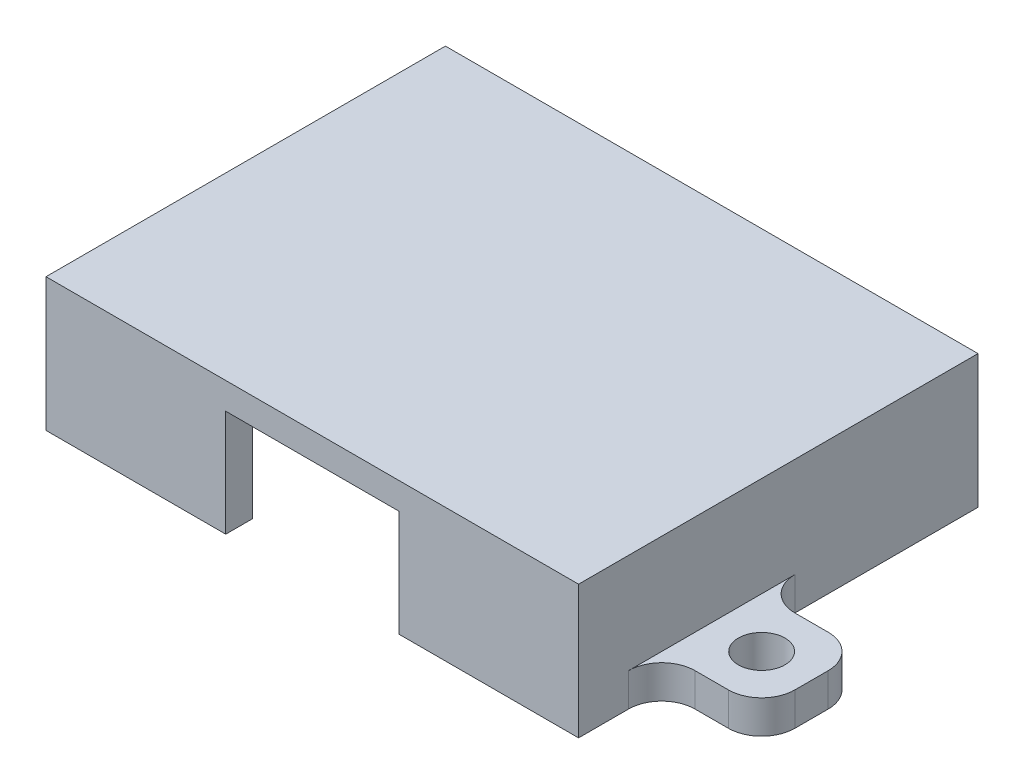
ISO-10303-21;
HEADER;
FILE_DESCRIPTION(('STEP AP214'),'2;1');
FILE_NAME('part.step','',(''),(''),'','','');
FILE_SCHEMA(('AUTOMOTIVE_DESIGN { 1 0 10303 214 1 1 1 1 }'));
ENDSEC;
DATA;
#1=APPLICATION_CONTEXT('core data for automotive mechanical design processes');
#2=APPLICATION_PROTOCOL_DEFINITION('international standard','automotive_design',2000,#1);
#3=PRODUCT_CONTEXT('',#1,'mechanical');
#4=PRODUCT('Part','Part','',(#3));
#5=PRODUCT_RELATED_PRODUCT_CATEGORY('part','',(#4));
#6=PRODUCT_DEFINITION_FORMATION('','',#4);
#7=PRODUCT_DEFINITION_CONTEXT('part definition',#1,'design');
#8=PRODUCT_DEFINITION('design','',#6,#7);
#9=PRODUCT_DEFINITION_SHAPE('','',#8);
#10=(LENGTH_UNIT() NAMED_UNIT(*) SI_UNIT(.MILLI.,.METRE.));
#11=(NAMED_UNIT(*) PLANE_ANGLE_UNIT() SI_UNIT($,.RADIAN.));
#12=(NAMED_UNIT(*) SI_UNIT($,.STERADIAN.) SOLID_ANGLE_UNIT());
#13=UNCERTAINTY_MEASURE_WITH_UNIT(LENGTH_MEASURE(1.E-05),#10,'distance_accuracy_value','');
#14=(GEOMETRIC_REPRESENTATION_CONTEXT(3) GLOBAL_UNCERTAINTY_ASSIGNED_CONTEXT((#13)) GLOBAL_UNIT_ASSIGNED_CONTEXT((#10,
#11,#12)) REPRESENTATION_CONTEXT('',''));
#15=CARTESIAN_POINT('',(0.,0.,0.));
#16=DIRECTION('',(0.,0.,1.));
#17=DIRECTION('',(1.,0.,0.));
#18=AXIS2_PLACEMENT_3D('',#15,#16,#17);
#19=CARTESIAN_POINT('',(0.,10.,0.));
#20=DIRECTION('',(1.,0.,0.));
#21=DIRECTION('',(0.,0.,-1.));
#22=AXIS2_PLACEMENT_3D('',#19,#20,#21);
#23=PLANE('',#22);
#24=DIRECTION('',(0.,0.,-1.));
#25=VECTOR('',#24,1.);
#26=CARTESIAN_POINT('',(0.,2.5,-6.25));
#27=LINE('',#26,#25);
#28=CARTESIAN_POINT('',(0.,2.5,-3.75));
#29=VERTEX_POINT('',#28);
#30=CARTESIAN_POINT('',(0.,2.5,-16.25));
#31=VERTEX_POINT('',#30);
#32=EDGE_CURVE('E492',#29,#31,#27,.T.);
#33=ORIENTED_EDGE('',*,*,#32,.F.);
#34=DIRECTION('',(0.,1.,0.));
#35=VECTOR('',#34,1.);
#36=CARTESIAN_POINT('',(0.,0.,-3.75));
#37=LINE('',#36,#35);
#38=CARTESIAN_POINT('',(0.,0.,-3.75));
#39=VERTEX_POINT('',#38);
#40=EDGE_CURVE('E356',#29,#39,#37,.F.);
#41=ORIENTED_EDGE('',*,*,#40,.T.);
#42=DIRECTION('',(0.,0.,1.));
#43=VECTOR('',#42,1.);
#44=CARTESIAN_POINT('',(0.,0.,0.));
#45=LINE('',#44,#43);
#46=CARTESIAN_POINT('',(0.,0.,0.));
#47=VERTEX_POINT('',#46);
#48=EDGE_CURVE('E310',#39,#47,#45,.T.);
#49=ORIENTED_EDGE('',*,*,#48,.T.);
#50=DIRECTION('',(0.,-1.,0.));
#51=VECTOR('',#50,1.);
#52=CARTESIAN_POINT('',(0.,10.,0.));
#53=LINE('',#52,#51);
#54=CARTESIAN_POINT('',(0.,10.,0.));
#55=VERTEX_POINT('',#54);
#56=EDGE_CURVE('E345',#55,#47,#53,.T.);
#57=ORIENTED_EDGE('',*,*,#56,.F.);
#58=DIRECTION('',(0.,0.,1.));
#59=VECTOR('',#58,1.);
#60=CARTESIAN_POINT('',(0.,10.,0.));
#61=LINE('',#60,#59);
#62=CARTESIAN_POINT('',(0.,10.,-30.));
#63=VERTEX_POINT('',#62);
#64=EDGE_CURVE('E312',#63,#55,#61,.T.);
#65=ORIENTED_EDGE('',*,*,#64,.F.);
#66=DIRECTION('',(0.,-1.,0.));
#67=VECTOR('',#66,1.);
#68=CARTESIAN_POINT('',(0.,10.,-30.));
#69=LINE('',#68,#67);
#70=CARTESIAN_POINT('',(0.,0.,-30.));
#71=VERTEX_POINT('',#70);
#72=EDGE_CURVE('E322',#63,#71,#69,.T.);
#73=ORIENTED_EDGE('',*,*,#72,.T.);
#74=CARTESIAN_POINT('',(0.,0.,-16.25));
#75=VERTEX_POINT('',#74);
#76=EDGE_CURVE('E323',#71,#75,#45,.T.);
#77=ORIENTED_EDGE('',*,*,#76,.T.);
#78=DIRECTION('',(0.,-1.,0.));
#79=VECTOR('',#78,1.);
#80=CARTESIAN_POINT('',(0.,2.5,-16.25));
#81=LINE('',#80,#79);
#82=EDGE_CURVE('E353',#75,#31,#81,.F.);
#83=ORIENTED_EDGE('',*,*,#82,.T.);
#84=EDGE_LOOP('',(#33,#41,#49,#57,#65,#73,#77,#83));
#85=FACE_BOUND('',#84,.T.);
#86=ADVANCED_FACE('F34',(#85),#23,.F.);
#87=CARTESIAN_POINT('',(0.,0.,0.));
#88=DIRECTION('',(0.,-1.,0.));
#89=DIRECTION('',(0.,0.,-1.));
#90=AXIS2_PLACEMENT_3D('',#87,#88,#89);
#91=PLANE('',#90);
#92=CARTESIAN_POINT('',(43.75,0.,-10.));
#93=DIRECTION('',(0.,-1.,0.));
#94=DIRECTION('',(0.,0.,1.));
#95=AXIS2_PLACEMENT_3D('',#92,#93,#94);
#96=CIRCLE('',#95,1.75);
#97=CARTESIAN_POINT('',(43.75,0.,-8.25));
#98=VERTEX_POINT('',#97);
#99=EDGE_CURVE('E645',#98,#98,#96,.T.);
#100=ORIENTED_EDGE('',*,*,#99,.F.);
#101=EDGE_LOOP('',(#100));
#102=FACE_BOUND('',#101,.T.);
#103=DIRECTION('',(-1.,0.,0.));
#104=VECTOR('',#103,1.);
#105=CARTESIAN_POINT('',(47.5,0.,-13.75));
#106=LINE('',#105,#104);
#107=CARTESIAN_POINT('',(45.,0.,-13.75));
#108=VERTEX_POINT('',#107);
#109=CARTESIAN_POINT('',(42.5,0.,-13.75));
#110=VERTEX_POINT('',#109);
#111=EDGE_CURVE('E472',#108,#110,#106,.T.);
#112=ORIENTED_EDGE('',*,*,#111,.F.);
#113=CARTESIAN_POINT('',(45.,0.,-11.25));
#114=DIRECTION('',(0.,-1.,0.));
#115=DIRECTION('',(0.,0.,-1.));
#116=AXIS2_PLACEMENT_3D('',#113,#114,#115);
#117=CIRCLE('',#116,2.5);
#118=CARTESIAN_POINT('',(47.5,0.,-11.25));
#119=VERTEX_POINT('',#118);
#120=EDGE_CURVE('E393',#108,#119,#117,.T.);
#121=ORIENTED_EDGE('',*,*,#120,.T.);
#122=DIRECTION('',(0.,0.,1.));
#123=VECTOR('',#122,1.);
#124=CARTESIAN_POINT('',(47.5,0.,-6.25));
#125=LINE('',#124,#123);
#126=CARTESIAN_POINT('',(47.5,0.,-8.75));
#127=VERTEX_POINT('',#126);
#128=EDGE_CURVE('E640',#119,#127,#125,.T.);
#129=ORIENTED_EDGE('',*,*,#128,.T.);
#130=CARTESIAN_POINT('',(45.,0.,-8.75));
#131=DIRECTION('',(0.,-1.,0.));
#132=DIRECTION('',(0.,0.,-1.));
#133=AXIS2_PLACEMENT_3D('',#130,#131,#132);
#134=CIRCLE('',#133,2.5);
#135=CARTESIAN_POINT('',(45.,0.,-6.25));
#136=VERTEX_POINT('',#135);
#137=EDGE_CURVE('E391',#127,#136,#134,.T.);
#138=ORIENTED_EDGE('',*,*,#137,.T.);
#139=DIRECTION('',(-1.,0.,0.));
#140=VECTOR('',#139,1.);
#141=CARTESIAN_POINT('',(47.5,0.,-6.25));
#142=LINE('',#141,#140);
#143=CARTESIAN_POINT('',(42.5,0.,-6.25));
#144=VERTEX_POINT('',#143);
#145=EDGE_CURVE('E437',#136,#144,#142,.T.);
#146=ORIENTED_EDGE('',*,*,#145,.T.);
#147=CARTESIAN_POINT('',(42.5,0.,-3.75));
#148=DIRECTION('',(0.,-1.,0.));
#149=DIRECTION('',(0.,0.,-1.));
#150=AXIS2_PLACEMENT_3D('',#147,#148,#149);
#151=CIRCLE('',#150,2.5);
#152=CARTESIAN_POINT('',(40.,0.,-3.75));
#153=VERTEX_POINT('',#152);
#154=EDGE_CURVE('E12',#144,#153,#151,.F.);
#155=ORIENTED_EDGE('',*,*,#154,.T.);
#156=DIRECTION('',(0.,0.,-1.));
#157=VECTOR('',#156,1.);
#158=CARTESIAN_POINT('',(40.,0.,0.));
#159=LINE('',#158,#157);
#160=CARTESIAN_POINT('',(40.,0.,0.));
#161=VERTEX_POINT('',#160);
#162=EDGE_CURVE('E331',#161,#153,#159,.T.);
#163=ORIENTED_EDGE('',*,*,#162,.F.);
#164=DIRECTION('',(1.,0.,0.));
#165=VECTOR('',#164,1.);
#166=CARTESIAN_POINT('',(0.,0.,0.));
#167=LINE('',#166,#165);
#168=CARTESIAN_POINT('',(26.5,0.,0.));
#169=VERTEX_POINT('',#168);
#170=EDGE_CURVE('E326',#169,#161,#167,.T.);
#171=ORIENTED_EDGE('',*,*,#170,.F.);
#172=DIRECTION('',(0.,0.,1.));
#173=VECTOR('',#172,1.);
#174=CARTESIAN_POINT('',(26.5,0.,0.));
#175=LINE('',#174,#173);
#176=CARTESIAN_POINT('',(26.5,0.,-2.));
#177=VERTEX_POINT('',#176);
#178=EDGE_CURVE('E284',#177,#169,#175,.T.);
#179=ORIENTED_EDGE('',*,*,#178,.F.);
#180=DIRECTION('',(-1.,0.,0.));
#181=VECTOR('',#180,1.);
#182=CARTESIAN_POINT('',(26.5,0.,-2.));
#183=LINE('',#182,#181);
#184=CARTESIAN_POINT('',(38.,0.,-2.));
#185=VERTEX_POINT('',#184);
#186=EDGE_CURVE('E281',#185,#177,#183,.T.);
#187=ORIENTED_EDGE('',*,*,#186,.F.);
#188=DIRECTION('',(0.,0.,1.));
#189=VECTOR('',#188,1.);
#190=CARTESIAN_POINT('',(38.,0.,-2.));
#191=LINE('',#190,#189);
#192=CARTESIAN_POINT('',(38.,0.,-30.));
#193=VERTEX_POINT('',#192);
#194=EDGE_CURVE('E278',#193,#185,#191,.T.);
#195=ORIENTED_EDGE('',*,*,#194,.F.);
#196=DIRECTION('',(-1.,0.,0.));
#197=VECTOR('',#196,1.);
#198=CARTESIAN_POINT('',(0.,0.,-30.));
#199=LINE('',#198,#197);
#200=CARTESIAN_POINT('',(40.,0.,-30.));
#201=VERTEX_POINT('',#200);
#202=EDGE_CURVE('E316',#201,#193,#199,.T.);
#203=ORIENTED_EDGE('',*,*,#202,.F.);
#204=CARTESIAN_POINT('',(40.,0.,-16.25));
#205=VERTEX_POINT('',#204);
#206=EDGE_CURVE('E330',#205,#201,#159,.T.);
#207=ORIENTED_EDGE('',*,*,#206,.F.);
#208=CARTESIAN_POINT('',(42.5,0.,-16.25));
#209=DIRECTION('',(0.,-1.,0.));
#210=DIRECTION('',(0.,0.,-1.));
#211=AXIS2_PLACEMENT_3D('',#208,#209,#210);
#212=CIRCLE('',#211,2.5);
#213=EDGE_CURVE('E412',#205,#110,#212,.F.);
#214=ORIENTED_EDGE('',*,*,#213,.T.);
#215=EDGE_LOOP('',(#112,#121,#129,#138,#146,#155,#163,#171,#179,#187,#195,#203,#207,#214));
#216=FACE_BOUND('',#215,.T.);
#217=ADVANCED_FACE('F435',(#102,#216),#91,.T.);
#218=DIRECTION('',(0.,0.,-1.));
#219=VECTOR('',#218,1.);
#220=CARTESIAN_POINT('',(32.,0.,-28.));
#221=LINE('',#220,#219);
#222=CARTESIAN_POINT('',(32.,0.,-28.));
#223=VERTEX_POINT('',#222);
#224=CARTESIAN_POINT('',(32.,0.,-30.));
#225=VERTEX_POINT('',#224);
#226=EDGE_CURVE('E276',#223,#225,#221,.T.);
#227=ORIENTED_EDGE('',*,*,#226,.F.);
#228=DIRECTION('',(1.,0.,0.));
#229=VECTOR('',#228,1.);
#230=CARTESIAN_POINT('',(8.,0.,-28.));
#231=LINE('',#230,#229);
#232=CARTESIAN_POINT('',(8.,0.,-28.));
#233=VERTEX_POINT('',#232);
#234=EDGE_CURVE('E270',#233,#223,#231,.T.);
#235=ORIENTED_EDGE('',*,*,#234,.F.);
#236=DIRECTION('',(0.,0.,1.));
#237=VECTOR('',#236,1.);
#238=CARTESIAN_POINT('',(8.,0.,-30.));
#239=LINE('',#238,#237);
#240=CARTESIAN_POINT('',(8.,0.,-30.));
#241=VERTEX_POINT('',#240);
#242=EDGE_CURVE('E267',#241,#233,#239,.T.);
#243=ORIENTED_EDGE('',*,*,#242,.F.);
#244=EDGE_CURVE('E336',#225,#241,#199,.T.);
#245=ORIENTED_EDGE('',*,*,#244,.F.);
#246=EDGE_LOOP('',(#227,#235,#243,#245));
#247=FACE_BOUND('',#246,.T.);
#248=ADVANCED_FACE('F579',(#247),#91,.T.);
#249=CARTESIAN_POINT('',(0.,10.,0.));
#250=DIRECTION('',(0.,0.,-1.));
#251=DIRECTION('',(-1.,0.,0.));
#252=AXIS2_PLACEMENT_3D('',#249,#250,#251);
#253=PLANE('',#252);
#254=CARTESIAN_POINT('',(13.5,0.,0.));
#255=VERTEX_POINT('',#254);
#256=EDGE_CURVE('E327',#47,#255,#167,.T.);
#257=ORIENTED_EDGE('',*,*,#256,.T.);
#258=DIRECTION('',(0.,-1.,0.));
#259=VECTOR('',#258,1.);
#260=CARTESIAN_POINT('',(13.5,56.8614980554399,0.));
#261=LINE('',#260,#259);
#262=CARTESIAN_POINT('',(13.5,8.,0.));
#263=VERTEX_POINT('',#262);
#264=EDGE_CURVE('E286',#263,#255,#261,.T.);
#265=ORIENTED_EDGE('',*,*,#264,.F.);
#266=DIRECTION('',(1.,0.,0.));
#267=VECTOR('',#266,1.);
#268=CARTESIAN_POINT('',(13.5,8.,0.));
#269=LINE('',#268,#267);
#270=CARTESIAN_POINT('',(26.5,8.,0.));
#271=VERTEX_POINT('',#270);
#272=EDGE_CURVE('E530',#263,#271,#269,.T.);
#273=ORIENTED_EDGE('',*,*,#272,.T.);
#274=DIRECTION('',(0.,-1.,0.));
#275=VECTOR('',#274,1.);
#276=CARTESIAN_POINT('',(26.5,56.8614980554399,0.));
#277=LINE('',#276,#275);
#278=EDGE_CURVE('E288',#271,#169,#277,.T.);
#279=ORIENTED_EDGE('',*,*,#278,.T.);
#280=ORIENTED_EDGE('',*,*,#170,.T.);
#281=DIRECTION('',(0.,-1.,0.));
#282=VECTOR('',#281,1.);
#283=CARTESIAN_POINT('',(40.,10.,0.));
#284=LINE('',#283,#282);
#285=CARTESIAN_POINT('',(40.,10.,0.));
#286=VERTEX_POINT('',#285);
#287=EDGE_CURVE('E342',#286,#161,#284,.T.);
#288=ORIENTED_EDGE('',*,*,#287,.F.);
#289=DIRECTION('',(1.,0.,0.));
#290=VECTOR('',#289,1.);
#291=CARTESIAN_POINT('',(0.,10.,0.));
#292=LINE('',#291,#290);
#293=EDGE_CURVE('E315',#55,#286,#292,.T.);
#294=ORIENTED_EDGE('',*,*,#293,.F.);
#295=ORIENTED_EDGE('',*,*,#56,.T.);
#296=EDGE_LOOP('',(#257,#265,#273,#279,#280,#288,#294,#295));
#297=FACE_BOUND('',#296,.T.);
#298=ADVANCED_FACE('F443',(#297),#253,.F.);
#299=CARTESIAN_POINT('',(40.,10.,0.));
#300=DIRECTION('',(-1.,0.,0.));
#301=DIRECTION('',(0.,0.,1.));
#302=AXIS2_PLACEMENT_3D('',#299,#300,#301);
#303=PLANE('',#302);
#304=DIRECTION('',(0.,0.,-1.));
#305=VECTOR('',#304,1.);
#306=CARTESIAN_POINT('',(40.,2.5,-6.25));
#307=LINE('',#306,#305);
#308=CARTESIAN_POINT('',(40.,2.5,-3.75));
#309=VERTEX_POINT('',#308);
#310=CARTESIAN_POINT('',(40.,2.5,-16.25));
#311=VERTEX_POINT('',#310);
#312=EDGE_CURVE('E49',#309,#311,#307,.T.);
#313=ORIENTED_EDGE('',*,*,#312,.T.);
#314=DIRECTION('',(0.,-1.,0.));
#315=VECTOR('',#314,1.);
#316=CARTESIAN_POINT('',(40.,10.,-16.25));
#317=LINE('',#316,#315);
#318=EDGE_CURVE('E405',#311,#205,#317,.T.);
#319=ORIENTED_EDGE('',*,*,#318,.T.);
#320=ORIENTED_EDGE('',*,*,#206,.T.);
#321=DIRECTION('',(0.,-1.,0.));
#322=VECTOR('',#321,1.);
#323=CARTESIAN_POINT('',(40.,10.,-30.));
#324=LINE('',#323,#322);
#325=CARTESIAN_POINT('',(40.,10.,-30.));
#326=VERTEX_POINT('',#325);
#327=EDGE_CURVE('E339',#326,#201,#324,.T.);
#328=ORIENTED_EDGE('',*,*,#327,.F.);
#329=DIRECTION('',(0.,0.,-1.));
#330=VECTOR('',#329,1.);
#331=CARTESIAN_POINT('',(40.,10.,0.));
#332=LINE('',#331,#330);
#333=EDGE_CURVE('E318',#286,#326,#332,.T.);
#334=ORIENTED_EDGE('',*,*,#333,.F.);
#335=ORIENTED_EDGE('',*,*,#287,.T.);
#336=ORIENTED_EDGE('',*,*,#162,.T.);
#337=DIRECTION('',(0.,1.,0.));
#338=VECTOR('',#337,1.);
#339=CARTESIAN_POINT('',(40.,10.,-3.75));
#340=LINE('',#339,#338);
#341=EDGE_CURVE('E403',#153,#309,#340,.T.);
#342=ORIENTED_EDGE('',*,*,#341,.T.);
#343=EDGE_LOOP('',(#313,#319,#320,#328,#334,#335,#336,#342));
#344=FACE_BOUND('',#343,.T.);
#345=ADVANCED_FACE('F438',(#344),#303,.F.);
#346=CARTESIAN_POINT('',(0.,10.,-30.));
#347=DIRECTION('',(0.,0.,1.));
#348=DIRECTION('',(1.,0.,0.));
#349=AXIS2_PLACEMENT_3D('',#346,#347,#348);
#350=PLANE('',#349);
#351=ORIENTED_EDGE('',*,*,#244,.T.);
#352=DIRECTION('',(0.,-1.,0.));
#353=VECTOR('',#352,1.);
#354=CARTESIAN_POINT('',(8.,56.8614980554399,-30.));
#355=LINE('',#354,#353);
#356=CARTESIAN_POINT('',(8.,8.,-30.));
#357=VERTEX_POINT('',#356);
#358=EDGE_CURVE('E304',#357,#241,#355,.T.);
#359=ORIENTED_EDGE('',*,*,#358,.F.);
#360=DIRECTION('',(-1.,0.,0.));
#361=VECTOR('',#360,1.);
#362=CARTESIAN_POINT('',(2.,8.,-30.));
#363=LINE('',#362,#361);
#364=CARTESIAN_POINT('',(2.,8.,-30.));
#365=VERTEX_POINT('',#364);
#366=EDGE_CURVE('E515',#357,#365,#363,.T.);
#367=ORIENTED_EDGE('',*,*,#366,.T.);
#368=DIRECTION('',(0.,-1.,0.));
#369=VECTOR('',#368,1.);
#370=CARTESIAN_POINT('',(2.,56.8614980554399,-30.));
#371=LINE('',#370,#369);
#372=CARTESIAN_POINT('',(2.,0.,-30.));
#373=VERTEX_POINT('',#372);
#374=EDGE_CURVE('E250',#365,#373,#371,.T.);
#375=ORIENTED_EDGE('',*,*,#374,.T.);
#376=EDGE_CURVE('E266',#373,#71,#199,.T.);
#377=ORIENTED_EDGE('',*,*,#376,.T.);
#378=ORIENTED_EDGE('',*,*,#72,.F.);
#379=DIRECTION('',(-1.,0.,0.));
#380=VECTOR('',#379,1.);
#381=CARTESIAN_POINT('',(0.,10.,-30.));
#382=LINE('',#381,#380);
#383=EDGE_CURVE('E320',#326,#63,#382,.T.);
#384=ORIENTED_EDGE('',*,*,#383,.F.);
#385=ORIENTED_EDGE('',*,*,#327,.T.);
#386=ORIENTED_EDGE('',*,*,#202,.T.);
#387=DIRECTION('',(0.,-1.,0.));
#388=VECTOR('',#387,1.);
#389=CARTESIAN_POINT('',(38.,56.8614980554399,-30.));
#390=LINE('',#389,#388);
#391=CARTESIAN_POINT('',(38.,8.,-30.));
#392=VERTEX_POINT('',#391);
#393=EDGE_CURVE('E295',#392,#193,#390,.T.);
#394=ORIENTED_EDGE('',*,*,#393,.F.);
#395=DIRECTION('',(-1.,0.,0.));
#396=VECTOR('',#395,1.);
#397=CARTESIAN_POINT('',(32.,8.,-30.));
#398=LINE('',#397,#396);
#399=CARTESIAN_POINT('',(32.,8.,-30.));
#400=VERTEX_POINT('',#399);
#401=EDGE_CURVE('E524',#392,#400,#398,.T.);
#402=ORIENTED_EDGE('',*,*,#401,.T.);
#403=DIRECTION('',(0.,-1.,0.));
#404=VECTOR('',#403,1.);
#405=CARTESIAN_POINT('',(32.,56.8614980554399,-30.));
#406=LINE('',#405,#404);
#407=EDGE_CURVE('E297',#400,#225,#406,.T.);
#408=ORIENTED_EDGE('',*,*,#407,.T.);
#409=EDGE_LOOP('',(#351,#359,#367,#375,#377,#378,#384,#385,#386,#394,#402,#408));
#410=FACE_BOUND('',#409,.T.);
#411=ADVANCED_FACE('F466',(#410),#350,.F.);
#412=CARTESIAN_POINT('',(0.,10.,0.));
#413=DIRECTION('',(0.,-1.,0.));
#414=DIRECTION('',(0.,0.,-1.));
#415=AXIS2_PLACEMENT_3D('',#412,#413,#414);
#416=PLANE('',#415);
#417=ORIENTED_EDGE('',*,*,#64,.T.);
#418=ORIENTED_EDGE('',*,*,#293,.T.);
#419=ORIENTED_EDGE('',*,*,#333,.T.);
#420=ORIENTED_EDGE('',*,*,#383,.T.);
#421=EDGE_LOOP('',(#417,#418,#419,#420));
#422=FACE_BOUND('',#421,.T.);
#423=ADVANCED_FACE('F751',(#422),#416,.F.);
#424=CARTESIAN_POINT('',(-3.75,0.,-10.));
#425=DIRECTION('',(0.,1.,0.));
#426=DIRECTION('',(0.,0.,1.));
#427=AXIS2_PLACEMENT_3D('',#424,#425,#426);
#428=CIRCLE('',#427,1.75);
#429=CARTESIAN_POINT('',(-3.75,0.,-8.25));
#430=VERTEX_POINT('',#429);
#431=EDGE_CURVE('E489',#430,#430,#428,.T.);
#432=ORIENTED_EDGE('',*,*,#431,.T.);
#433=EDGE_LOOP('',(#432));
#434=FACE_BOUND('',#433,.T.);
#435=DIRECTION('',(1.,0.,0.));
#436=VECTOR('',#435,1.);
#437=CARTESIAN_POINT('',(-7.5,0.,-6.25));
#438=LINE('',#437,#436);
#439=CARTESIAN_POINT('',(-5.,0.,-6.25));
#440=VERTEX_POINT('',#439);
#441=CARTESIAN_POINT('',(-2.5,0.,-6.25));
#442=VERTEX_POINT('',#441);
#443=EDGE_CURVE('E501',#440,#442,#438,.T.);
#444=ORIENTED_EDGE('',*,*,#443,.F.);
#445=CARTESIAN_POINT('',(-5.,0.,-8.75));
#446=DIRECTION('',(0.,-1.,0.));
#447=DIRECTION('',(0.,0.,-1.));
#448=AXIS2_PLACEMENT_3D('',#445,#446,#447);
#449=CIRCLE('',#448,2.5);
#450=CARTESIAN_POINT('',(-7.5,0.,-8.75));
#451=VERTEX_POINT('',#450);
#452=EDGE_CURVE('E370',#440,#451,#449,.T.);
#453=ORIENTED_EDGE('',*,*,#452,.T.);
#454=DIRECTION('',(0.,0.,1.));
#455=VECTOR('',#454,1.);
#456=CARTESIAN_POINT('',(-7.5,0.,-6.25));
#457=LINE('',#456,#455);
#458=CARTESIAN_POINT('',(-7.5,0.,-11.25));
#459=VERTEX_POINT('',#458);
#460=EDGE_CURVE('E498',#459,#451,#457,.T.);
#461=ORIENTED_EDGE('',*,*,#460,.F.);
#462=CARTESIAN_POINT('',(-5.,0.,-11.25));
#463=DIRECTION('',(0.,-1.,0.));
#464=DIRECTION('',(0.,0.,-1.));
#465=AXIS2_PLACEMENT_3D('',#462,#463,#464);
#466=CIRCLE('',#465,2.5);
#467=CARTESIAN_POINT('',(-5.,0.,-13.75));
#468=VERTEX_POINT('',#467);
#469=EDGE_CURVE('E368',#459,#468,#466,.T.);
#470=ORIENTED_EDGE('',*,*,#469,.T.);
#471=DIRECTION('',(1.,0.,0.));
#472=VECTOR('',#471,1.);
#473=CARTESIAN_POINT('',(-7.5,0.,-13.75));
#474=LINE('',#473,#472);
#475=CARTESIAN_POINT('',(-2.5,0.,-13.75));
#476=VERTEX_POINT('',#475);
#477=EDGE_CURVE('E505',#468,#476,#474,.T.);
#478=ORIENTED_EDGE('',*,*,#477,.T.);
#479=CARTESIAN_POINT('',(-2.5,0.,-16.25));
#480=DIRECTION('',(0.,-1.,0.));
#481=DIRECTION('',(0.,0.,-1.));
#482=AXIS2_PLACEMENT_3D('',#479,#480,#481);
#483=CIRCLE('',#482,2.5);
#484=EDGE_CURVE('E382',#476,#75,#483,.F.);
#485=ORIENTED_EDGE('',*,*,#484,.T.);
#486=ORIENTED_EDGE('',*,*,#76,.F.);
#487=ORIENTED_EDGE('',*,*,#376,.F.);
#488=DIRECTION('',(0.,0.,-1.));
#489=VECTOR('',#488,1.);
#490=CARTESIAN_POINT('',(2.,0.,-28.));
#491=LINE('',#490,#489);
#492=CARTESIAN_POINT('',(2.,0.,-2.));
#493=VERTEX_POINT('',#492);
#494=EDGE_CURVE('E245',#493,#373,#491,.T.);
#495=ORIENTED_EDGE('',*,*,#494,.F.);
#496=DIRECTION('',(-1.,0.,0.));
#497=VECTOR('',#496,1.);
#498=CARTESIAN_POINT('',(2.,0.,-2.));
#499=LINE('',#498,#497);
#500=CARTESIAN_POINT('',(13.5,0.,-2.));
#501=VERTEX_POINT('',#500);
#502=EDGE_CURVE('E255',#501,#493,#499,.T.);
#503=ORIENTED_EDGE('',*,*,#502,.F.);
#504=DIRECTION('',(0.,0.,-1.));
#505=VECTOR('',#504,1.);
#506=CARTESIAN_POINT('',(13.5,0.,-2.));
#507=LINE('',#506,#505);
#508=EDGE_CURVE('E260',#255,#501,#507,.T.);
#509=ORIENTED_EDGE('',*,*,#508,.F.);
#510=ORIENTED_EDGE('',*,*,#256,.F.);
#511=ORIENTED_EDGE('',*,*,#48,.F.);
#512=CARTESIAN_POINT('',(-2.5,0.,-3.75));
#513=DIRECTION('',(0.,-1.,0.));
#514=DIRECTION('',(0.,0.,-1.));
#515=AXIS2_PLACEMENT_3D('',#512,#513,#514);
#516=CIRCLE('',#515,2.5);
#517=EDGE_CURVE('E380',#39,#442,#516,.F.);
#518=ORIENTED_EDGE('',*,*,#517,.T.);
#519=EDGE_LOOP('',(#444,#453,#461,#470,#478,#485,#486,#487,#495,#503,#509,#510,#511,#518));
#520=FACE_BOUND('',#519,.T.);
#521=ADVANCED_FACE('F264',(#434,#520),#91,.T.);
#522=CARTESIAN_POINT('',(13.5,56.8614980554399,-2.));
#523=DIRECTION('',(-1.,0.,0.));
#524=DIRECTION('',(0.,0.,1.));
#525=AXIS2_PLACEMENT_3D('',#522,#523,#524);
#526=PLANE('',#525);
#527=DIRECTION('',(0.,0.,1.));
#528=VECTOR('',#527,1.);
#529=CARTESIAN_POINT('',(13.5,8.,-2.));
#530=LINE('',#529,#528);
#531=CARTESIAN_POINT('',(13.5,8.,-2.));
#532=VERTEX_POINT('',#531);
#533=EDGE_CURVE('E311',#532,#263,#530,.T.);
#534=ORIENTED_EDGE('',*,*,#533,.T.);
#535=ORIENTED_EDGE('',*,*,#264,.T.);
#536=ORIENTED_EDGE('',*,*,#508,.T.);
#537=DIRECTION('',(0.,-1.,0.));
#538=VECTOR('',#537,1.);
#539=CARTESIAN_POINT('',(13.5,56.8614980554399,-2.));
#540=LINE('',#539,#538);
#541=EDGE_CURVE('E251',#532,#501,#540,.T.);
#542=ORIENTED_EDGE('',*,*,#541,.F.);
#543=EDGE_LOOP('',(#534,#535,#536,#542));
#544=FACE_BOUND('',#543,.T.);
#545=ADVANCED_FACE('F533',(#544),#526,.F.);
#546=CARTESIAN_POINT('',(26.5,56.8614980554399,0.));
#547=DIRECTION('',(1.,0.,0.));
#548=DIRECTION('',(0.,0.,-1.));
#549=AXIS2_PLACEMENT_3D('',#546,#547,#548);
#550=PLANE('',#549);
#551=DIRECTION('',(0.,0.,-1.));
#552=VECTOR('',#551,1.);
#553=CARTESIAN_POINT('',(26.5,8.,0.));
#554=LINE('',#553,#552);
#555=CARTESIAN_POINT('',(26.5,8.,-2.));
#556=VERTEX_POINT('',#555);
#557=EDGE_CURVE('E452',#271,#556,#554,.T.);
#558=ORIENTED_EDGE('',*,*,#557,.T.);
#559=DIRECTION('',(0.,-1.,0.));
#560=VECTOR('',#559,1.);
#561=CARTESIAN_POINT('',(26.5,56.8614980554399,-2.));
#562=LINE('',#561,#560);
#563=EDGE_CURVE('E291',#556,#177,#562,.T.);
#564=ORIENTED_EDGE('',*,*,#563,.T.);
#565=ORIENTED_EDGE('',*,*,#178,.T.);
#566=ORIENTED_EDGE('',*,*,#278,.F.);
#567=EDGE_LOOP('',(#558,#564,#565,#566));
#568=FACE_BOUND('',#567,.T.);
#569=ADVANCED_FACE('F450',(#568),#550,.F.);
#570=CARTESIAN_POINT('',(26.5,56.8614980554399,-2.));
#571=DIRECTION('',(0.,0.,1.));
#572=DIRECTION('',(1.,0.,0.));
#573=AXIS2_PLACEMENT_3D('',#570,#571,#572);
#574=PLANE('',#573);
#575=DIRECTION('',(1.,0.,0.));
#576=VECTOR('',#575,1.);
#577=CARTESIAN_POINT('',(26.5,8.,-2.));
#578=LINE('',#577,#576);
#579=CARTESIAN_POINT('',(38.,8.,-2.));
#580=VERTEX_POINT('',#579);
#581=EDGE_CURVE('E457',#556,#580,#578,.T.);
#582=ORIENTED_EDGE('',*,*,#581,.T.);
#583=DIRECTION('',(0.,-1.,0.));
#584=VECTOR('',#583,1.);
#585=CARTESIAN_POINT('',(38.,56.8614980554399,-2.));
#586=LINE('',#585,#584);
#587=EDGE_CURVE('E293',#580,#185,#586,.T.);
#588=ORIENTED_EDGE('',*,*,#587,.T.);
#589=ORIENTED_EDGE('',*,*,#186,.T.);
#590=ORIENTED_EDGE('',*,*,#563,.F.);
#591=EDGE_LOOP('',(#582,#588,#589,#590));
#592=FACE_BOUND('',#591,.T.);
#593=ADVANCED_FACE('F455',(#592),#574,.F.);
#594=CARTESIAN_POINT('',(38.,56.8614980554399,-2.));
#595=DIRECTION('',(1.,0.,0.));
#596=DIRECTION('',(0.,0.,-1.));
#597=AXIS2_PLACEMENT_3D('',#594,#595,#596);
#598=PLANE('',#597);
#599=DIRECTION('',(0.,0.,-1.));
#600=VECTOR('',#599,1.);
#601=CARTESIAN_POINT('',(38.,8.,-2.));
#602=LINE('',#601,#600);
#603=EDGE_CURVE('E526',#580,#392,#602,.T.);
#604=ORIENTED_EDGE('',*,*,#603,.T.);
#605=ORIENTED_EDGE('',*,*,#393,.T.);
#606=ORIENTED_EDGE('',*,*,#194,.T.);
#607=ORIENTED_EDGE('',*,*,#587,.F.);
#608=EDGE_LOOP('',(#604,#605,#606,#607));
#609=FACE_BOUND('',#608,.T.);
#610=ADVANCED_FACE('F460',(#609),#598,.F.);
#611=CARTESIAN_POINT('',(32.,56.8614980554399,-28.));
#612=DIRECTION('',(-1.,0.,0.));
#613=DIRECTION('',(0.,0.,1.));
#614=AXIS2_PLACEMENT_3D('',#611,#612,#613);
#615=PLANE('',#614);
#616=DIRECTION('',(0.,0.,1.));
#617=VECTOR('',#616,1.);
#618=CARTESIAN_POINT('',(32.,8.,-28.));
#619=LINE('',#618,#617);
#620=CARTESIAN_POINT('',(32.,8.,-28.));
#621=VERTEX_POINT('',#620);
#622=EDGE_CURVE('E522',#400,#621,#619,.T.);
#623=ORIENTED_EDGE('',*,*,#622,.T.);
#624=DIRECTION('',(0.,-1.,0.));
#625=VECTOR('',#624,1.);
#626=CARTESIAN_POINT('',(32.,56.8614980554399,-28.));
#627=LINE('',#626,#625);
#628=EDGE_CURVE('E300',#621,#223,#627,.T.);
#629=ORIENTED_EDGE('',*,*,#628,.T.);
#630=ORIENTED_EDGE('',*,*,#226,.T.);
#631=ORIENTED_EDGE('',*,*,#407,.F.);
#632=EDGE_LOOP('',(#623,#629,#630,#631));
#633=FACE_BOUND('',#632,.T.);
#634=ADVANCED_FACE('F594',(#633),#615,.F.);
#635=CARTESIAN_POINT('',(8.,56.8614980554399,-28.));
#636=DIRECTION('',(0.,0.,-1.));
#637=DIRECTION('',(-1.,0.,0.));
#638=AXIS2_PLACEMENT_3D('',#635,#636,#637);
#639=PLANE('',#638);
#640=DIRECTION('',(-1.,0.,0.));
#641=VECTOR('',#640,1.);
#642=CARTESIAN_POINT('',(8.,8.,-28.));
#643=LINE('',#642,#641);
#644=CARTESIAN_POINT('',(8.,8.,-28.));
#645=VERTEX_POINT('',#644);
#646=EDGE_CURVE('E520',#621,#645,#643,.T.);
#647=ORIENTED_EDGE('',*,*,#646,.T.);
#648=DIRECTION('',(0.,-1.,0.));
#649=VECTOR('',#648,1.);
#650=CARTESIAN_POINT('',(8.,56.8614980554399,-28.));
#651=LINE('',#650,#649);
#652=EDGE_CURVE('E302',#645,#233,#651,.T.);
#653=ORIENTED_EDGE('',*,*,#652,.T.);
#654=ORIENTED_EDGE('',*,*,#234,.T.);
#655=ORIENTED_EDGE('',*,*,#628,.F.);
#656=EDGE_LOOP('',(#647,#653,#654,#655));
#657=FACE_BOUND('',#656,.T.);
#658=ADVANCED_FACE('F596',(#657),#639,.F.);
#659=CARTESIAN_POINT('',(8.,56.8614980554399,-30.));
#660=DIRECTION('',(1.,0.,0.));
#661=DIRECTION('',(0.,0.,-1.));
#662=AXIS2_PLACEMENT_3D('',#659,#660,#661);
#663=PLANE('',#662);
#664=DIRECTION('',(0.,0.,-1.));
#665=VECTOR('',#664,1.);
#666=CARTESIAN_POINT('',(8.,8.,-30.));
#667=LINE('',#666,#665);
#668=EDGE_CURVE('E518',#645,#357,#667,.T.);
#669=ORIENTED_EDGE('',*,*,#668,.T.);
#670=ORIENTED_EDGE('',*,*,#358,.T.);
#671=ORIENTED_EDGE('',*,*,#242,.T.);
#672=ORIENTED_EDGE('',*,*,#652,.F.);
#673=EDGE_LOOP('',(#669,#670,#671,#672));
#674=FACE_BOUND('',#673,.T.);
#675=ADVANCED_FACE('F583',(#674),#663,.F.);
#676=CARTESIAN_POINT('',(2.,56.8614980554399,-28.));
#677=DIRECTION('',(-1.,0.,0.));
#678=DIRECTION('',(0.,0.,1.));
#679=AXIS2_PLACEMENT_3D('',#676,#677,#678);
#680=PLANE('',#679);
#681=DIRECTION('',(0.,0.,1.));
#682=VECTOR('',#681,1.);
#683=CARTESIAN_POINT('',(2.,8.,-28.));
#684=LINE('',#683,#682);
#685=CARTESIAN_POINT('',(2.,8.,-2.));
#686=VERTEX_POINT('',#685);
#687=EDGE_CURVE('E247',#365,#686,#684,.T.);
#688=ORIENTED_EDGE('',*,*,#687,.T.);
#689=DIRECTION('',(0.,-1.,0.));
#690=VECTOR('',#689,1.);
#691=CARTESIAN_POINT('',(2.,56.8614980554399,-2.));
#692=LINE('',#691,#690);
#693=EDGE_CURVE('E240',#686,#493,#692,.T.);
#694=ORIENTED_EDGE('',*,*,#693,.T.);
#695=ORIENTED_EDGE('',*,*,#494,.T.);
#696=ORIENTED_EDGE('',*,*,#374,.F.);
#697=EDGE_LOOP('',(#688,#694,#695,#696));
#698=FACE_BOUND('',#697,.T.);
#699=ADVANCED_FACE('F242',(#698),#680,.F.);
#700=CARTESIAN_POINT('',(2.,56.8614980554399,-2.));
#701=DIRECTION('',(0.,0.,1.));
#702=DIRECTION('',(1.,0.,0.));
#703=AXIS2_PLACEMENT_3D('',#700,#701,#702);
#704=PLANE('',#703);
#705=DIRECTION('',(1.,0.,0.));
#706=VECTOR('',#705,1.);
#707=CARTESIAN_POINT('',(2.,8.,-2.));
#708=LINE('',#707,#706);
#709=EDGE_CURVE('E308',#686,#532,#708,.T.);
#710=ORIENTED_EDGE('',*,*,#709,.T.);
#711=ORIENTED_EDGE('',*,*,#541,.T.);
#712=ORIENTED_EDGE('',*,*,#502,.T.);
#713=ORIENTED_EDGE('',*,*,#693,.F.);
#714=EDGE_LOOP('',(#710,#711,#712,#713));
#715=FACE_BOUND('',#714,.T.);
#716=ADVANCED_FACE('F256',(#715),#704,.F.);
#717=CARTESIAN_POINT('',(0.,8.,0.));
#718=DIRECTION('',(0.,-1.,0.));
#719=DIRECTION('',(0.,0.,-1.));
#720=AXIS2_PLACEMENT_3D('',#717,#718,#719);
#721=PLANE('',#720);
#722=ORIENTED_EDGE('',*,*,#533,.F.);
#723=ORIENTED_EDGE('',*,*,#709,.F.);
#724=ORIENTED_EDGE('',*,*,#687,.F.);
#725=ORIENTED_EDGE('',*,*,#366,.F.);
#726=ORIENTED_EDGE('',*,*,#668,.F.);
#727=ORIENTED_EDGE('',*,*,#646,.F.);
#728=ORIENTED_EDGE('',*,*,#622,.F.);
#729=ORIENTED_EDGE('',*,*,#401,.F.);
#730=ORIENTED_EDGE('',*,*,#603,.F.);
#731=ORIENTED_EDGE('',*,*,#581,.F.);
#732=ORIENTED_EDGE('',*,*,#557,.F.);
#733=ORIENTED_EDGE('',*,*,#272,.F.);
#734=EDGE_LOOP('',(#722,#723,#724,#725,#726,#727,#728,#729,#730,#731,#732,#733));
#735=FACE_BOUND('',#734,.T.);
#736=ADVANCED_FACE('F589',(#735),#721,.T.);
#737=CARTESIAN_POINT('',(-7.5,0.,-6.25));
#738=DIRECTION('',(0.,0.,-1.));
#739=DIRECTION('',(0.,1.,0.));
#740=AXIS2_PLACEMENT_3D('',#737,#738,#739);
#741=PLANE('',#740);
#742=ORIENTED_EDGE('',*,*,#443,.T.);
#743=DIRECTION('',(0.,1.,0.));
#744=VECTOR('',#743,1.);
#745=CARTESIAN_POINT('',(-2.5,2.5,-6.25));
#746=LINE('',#745,#744);
#747=CARTESIAN_POINT('',(-2.5,2.5,-6.25));
#748=VERTEX_POINT('',#747);
#749=EDGE_CURVE('E350',#442,#748,#746,.T.);
#750=ORIENTED_EDGE('',*,*,#749,.T.);
#751=DIRECTION('',(1.,0.,0.));
#752=VECTOR('',#751,1.);
#753=CARTESIAN_POINT('',(-7.5,2.5,-6.25));
#754=LINE('',#753,#752);
#755=CARTESIAN_POINT('',(-5.,2.5,-6.25));
#756=VERTEX_POINT('',#755);
#757=EDGE_CURVE('E511',#756,#748,#754,.T.);
#758=ORIENTED_EDGE('',*,*,#757,.F.);
#759=DIRECTION('',(0.,1.,0.));
#760=VECTOR('',#759,1.);
#761=CARTESIAN_POINT('',(-5.,0.,-6.25));
#762=LINE('',#761,#760);
#763=EDGE_CURVE('E348',#756,#440,#762,.F.);
#764=ORIENTED_EDGE('',*,*,#763,.T.);
#765=EDGE_LOOP('',(#742,#750,#758,#764));
#766=FACE_BOUND('',#765,.T.);
#767=ADVANCED_FACE('F547',(#766),#741,.F.);
#768=CARTESIAN_POINT('',(-7.5,2.5,-6.25));
#769=DIRECTION('',(0.,-1.,0.));
#770=DIRECTION('',(0.,0.,-1.));
#771=AXIS2_PLACEMENT_3D('',#768,#769,#770);
#772=PLANE('',#771);
#773=CARTESIAN_POINT('',(-3.75,2.5,-10.));
#774=DIRECTION('',(0.,1.,0.));
#775=DIRECTION('',(0.,0.,1.));
#776=AXIS2_PLACEMENT_3D('',#773,#774,#775);
#777=CIRCLE('',#776,1.75);
#778=CARTESIAN_POINT('',(-3.75,2.5,-8.25));
#779=VERTEX_POINT('',#778);
#780=EDGE_CURVE('E488',#779,#779,#777,.T.);
#781=ORIENTED_EDGE('',*,*,#780,.F.);
#782=EDGE_LOOP('',(#781));
#783=FACE_BOUND('',#782,.T.);
#784=DIRECTION('',(0.,0.,-1.));
#785=VECTOR('',#784,1.);
#786=CARTESIAN_POINT('',(-7.5,2.5,-6.25));
#787=LINE('',#786,#785);
#788=CARTESIAN_POINT('',(-7.5,2.5,-8.75));
#789=VERTEX_POINT('',#788);
#790=CARTESIAN_POINT('',(-7.5,2.5,-11.25));
#791=VERTEX_POINT('',#790);
#792=EDGE_CURVE('E495',#789,#791,#787,.T.);
#793=ORIENTED_EDGE('',*,*,#792,.F.);
#794=CARTESIAN_POINT('',(-5.,2.5,-8.75));
#795=DIRECTION('',(0.,-1.,0.));
#796=DIRECTION('',(0.,0.,-1.));
#797=AXIS2_PLACEMENT_3D('',#794,#795,#796);
#798=CIRCLE('',#797,2.5);
#799=EDGE_CURVE('E366',#789,#756,#798,.F.);
#800=ORIENTED_EDGE('',*,*,#799,.T.);
#801=ORIENTED_EDGE('',*,*,#757,.T.);
#802=CARTESIAN_POINT('',(-2.5,2.5,-3.75));
#803=DIRECTION('',(0.,-1.,0.));
#804=DIRECTION('',(0.,0.,-1.));
#805=AXIS2_PLACEMENT_3D('',#802,#803,#804);
#806=CIRCLE('',#805,2.5);
#807=EDGE_CURVE('E377',#748,#29,#806,.T.);
#808=ORIENTED_EDGE('',*,*,#807,.T.);
#809=ORIENTED_EDGE('',*,*,#32,.T.);
#810=CARTESIAN_POINT('',(-2.5,2.5,-16.25));
#811=DIRECTION('',(0.,-1.,0.));
#812=DIRECTION('',(0.,0.,-1.));
#813=AXIS2_PLACEMENT_3D('',#810,#811,#812);
#814=CIRCLE('',#813,2.5);
#815=CARTESIAN_POINT('',(-2.5,2.5,-13.75));
#816=VERTEX_POINT('',#815);
#817=EDGE_CURVE('E384',#31,#816,#814,.T.);
#818=ORIENTED_EDGE('',*,*,#817,.T.);
#819=DIRECTION('',(1.,0.,0.));
#820=VECTOR('',#819,1.);
#821=CARTESIAN_POINT('',(-7.5,2.5,-13.75));
#822=LINE('',#821,#820);
#823=CARTESIAN_POINT('',(-5.,2.5,-13.75));
#824=VERTEX_POINT('',#823);
#825=EDGE_CURVE('E508',#824,#816,#822,.T.);
#826=ORIENTED_EDGE('',*,*,#825,.F.);
#827=CARTESIAN_POINT('',(-5.,2.5,-11.25));
#828=DIRECTION('',(0.,-1.,0.));
#829=DIRECTION('',(0.,0.,-1.));
#830=AXIS2_PLACEMENT_3D('',#827,#828,#829);
#831=CIRCLE('',#830,2.5);
#832=EDGE_CURVE('E364',#824,#791,#831,.F.);
#833=ORIENTED_EDGE('',*,*,#832,.T.);
#834=EDGE_LOOP('',(#793,#800,#801,#808,#809,#818,#826,#833));
#835=FACE_BOUND('',#834,.T.);
#836=ADVANCED_FACE('F551',(#783,#835),#772,.F.);
#837=CARTESIAN_POINT('',(-7.5,0.,-13.75));
#838=DIRECTION('',(0.,0.,1.));
#839=DIRECTION('',(1.,0.,0.));
#840=AXIS2_PLACEMENT_3D('',#837,#838,#839);
#841=PLANE('',#840);
#842=ORIENTED_EDGE('',*,*,#477,.F.);
#843=DIRECTION('',(0.,-1.,0.));
#844=VECTOR('',#843,1.);
#845=CARTESIAN_POINT('',(-5.,2.5,-13.75));
#846=LINE('',#845,#844);
#847=EDGE_CURVE('E375',#468,#824,#846,.F.);
#848=ORIENTED_EDGE('',*,*,#847,.T.);
#849=ORIENTED_EDGE('',*,*,#825,.T.);
#850=DIRECTION('',(0.,-1.,0.));
#851=VECTOR('',#850,1.);
#852=CARTESIAN_POINT('',(-2.5,0.,-13.75));
#853=LINE('',#852,#851);
#854=EDGE_CURVE('E372',#816,#476,#853,.T.);
#855=ORIENTED_EDGE('',*,*,#854,.T.);
#856=EDGE_LOOP('',(#842,#848,#849,#855));
#857=FACE_BOUND('',#856,.T.);
#858=ADVANCED_FACE('F564',(#857),#841,.F.);
#859=CARTESIAN_POINT('',(-7.5,0.,0.));
#860=DIRECTION('',(-1.,0.,0.));
#861=DIRECTION('',(0.,0.,1.));
#862=AXIS2_PLACEMENT_3D('',#859,#860,#861);
#863=PLANE('',#862);
#864=ORIENTED_EDGE('',*,*,#460,.T.);
#865=DIRECTION('',(0.,1.,0.));
#866=VECTOR('',#865,1.);
#867=CARTESIAN_POINT('',(-7.5,2.5,-8.75));
#868=LINE('',#867,#866);
#869=EDGE_CURVE('E361',#451,#789,#868,.T.);
#870=ORIENTED_EDGE('',*,*,#869,.T.);
#871=ORIENTED_EDGE('',*,*,#792,.T.);
#872=DIRECTION('',(0.,-1.,0.));
#873=VECTOR('',#872,1.);
#874=CARTESIAN_POINT('',(-7.5,0.,-11.25));
#875=LINE('',#874,#873);
#876=EDGE_CURVE('E358',#791,#459,#875,.T.);
#877=ORIENTED_EDGE('',*,*,#876,.T.);
#878=EDGE_LOOP('',(#864,#870,#871,#877));
#879=FACE_BOUND('',#878,.T.);
#880=ADVANCED_FACE('F557',(#879),#863,.T.);
#881=CARTESIAN_POINT('',(-3.75,0.,-10.));
#882=DIRECTION('',(0.,1.,0.));
#883=DIRECTION('',(0.,0.,1.));
#884=AXIS2_PLACEMENT_3D('',#881,#882,#883);
#885=CYLINDRICAL_SURFACE('',#884,1.75);
#886=ORIENTED_EDGE('',*,*,#431,.F.);
#887=EDGE_LOOP('',(#886));
#888=FACE_BOUND('',#887,.T.);
#889=ORIENTED_EDGE('',*,*,#780,.T.);
#890=EDGE_LOOP('',(#889));
#891=FACE_BOUND('',#890,.T.);
#892=ADVANCED_FACE('F617',(#888,#891),#885,.F.);
#893=CARTESIAN_POINT('',(-2.5,0.,-3.75));
#894=DIRECTION('',(0.,-1.,0.));
#895=DIRECTION('',(0.,0.,-1.));
#896=AXIS2_PLACEMENT_3D('',#893,#894,#895);
#897=CYLINDRICAL_SURFACE('',#896,2.5);
#898=ORIENTED_EDGE('',*,*,#517,.F.);
#899=ORIENTED_EDGE('',*,*,#40,.F.);
#900=ORIENTED_EDGE('',*,*,#807,.F.);
#901=ORIENTED_EDGE('',*,*,#749,.F.);
#902=EDGE_LOOP('',(#898,#899,#900,#901));
#903=FACE_BOUND('',#902,.T.);
#904=ADVANCED_FACE('F544',(#903),#897,.F.);
#905=CARTESIAN_POINT('',(-5.,0.,-8.75));
#906=DIRECTION('',(0.,-1.,0.));
#907=DIRECTION('',(0.,0.,-1.));
#908=AXIS2_PLACEMENT_3D('',#905,#906,#907);
#909=CYLINDRICAL_SURFACE('',#908,2.5);
#910=ORIENTED_EDGE('',*,*,#452,.F.);
#911=ORIENTED_EDGE('',*,*,#763,.F.);
#912=ORIENTED_EDGE('',*,*,#799,.F.);
#913=ORIENTED_EDGE('',*,*,#869,.F.);
#914=EDGE_LOOP('',(#910,#911,#912,#913));
#915=FACE_BOUND('',#914,.T.);
#916=ADVANCED_FACE('F555',(#915),#909,.T.);
#917=CARTESIAN_POINT('',(-5.,0.,-11.25));
#918=DIRECTION('',(0.,1.,0.));
#919=DIRECTION('',(0.,0.,1.));
#920=AXIS2_PLACEMENT_3D('',#917,#918,#919);
#921=CYLINDRICAL_SURFACE('',#920,2.5);
#922=ORIENTED_EDGE('',*,*,#832,.F.);
#923=ORIENTED_EDGE('',*,*,#847,.F.);
#924=ORIENTED_EDGE('',*,*,#469,.F.);
#925=ORIENTED_EDGE('',*,*,#876,.F.);
#926=EDGE_LOOP('',(#922,#923,#924,#925));
#927=FACE_BOUND('',#926,.T.);
#928=ADVANCED_FACE('F568',(#927),#921,.T.);
#929=CARTESIAN_POINT('',(-2.5,0.,-16.25));
#930=DIRECTION('',(0.,1.,0.));
#931=DIRECTION('',(0.,0.,1.));
#932=AXIS2_PLACEMENT_3D('',#929,#930,#931);
#933=CYLINDRICAL_SURFACE('',#932,2.5);
#934=ORIENTED_EDGE('',*,*,#817,.F.);
#935=ORIENTED_EDGE('',*,*,#82,.F.);
#936=ORIENTED_EDGE('',*,*,#484,.F.);
#937=ORIENTED_EDGE('',*,*,#854,.F.);
#938=EDGE_LOOP('',(#934,#935,#936,#937));
#939=FACE_BOUND('',#938,.T.);
#940=ADVANCED_FACE('F571',(#939),#933,.F.);
#941=CARTESIAN_POINT('',(47.5,0.,-6.25));
#942=DIRECTION('',(0.,0.,1.));
#943=DIRECTION('',(0.,-1.,0.));
#944=AXIS2_PLACEMENT_3D('',#941,#942,#943);
#945=PLANE('',#944);
#946=ORIENTED_EDGE('',*,*,#145,.F.);
#947=DIRECTION('',(0.,1.,0.));
#948=VECTOR('',#947,1.);
#949=CARTESIAN_POINT('',(45.,0.,-6.25));
#950=LINE('',#949,#948);
#951=CARTESIAN_POINT('',(45.,2.5,-6.25));
#952=VERTEX_POINT('',#951);
#953=EDGE_CURVE('E409',#136,#952,#950,.T.);
#954=ORIENTED_EDGE('',*,*,#953,.T.);
#955=DIRECTION('',(-1.,0.,0.));
#956=VECTOR('',#955,1.);
#957=CARTESIAN_POINT('',(47.5,2.5,-6.25));
#958=LINE('',#957,#956);
#959=CARTESIAN_POINT('',(42.5,2.5,-6.25));
#960=VERTEX_POINT('',#959);
#961=EDGE_CURVE('E419',#952,#960,#958,.T.);
#962=ORIENTED_EDGE('',*,*,#961,.T.);
#963=DIRECTION('',(0.,1.,0.));
#964=VECTOR('',#963,1.);
#965=CARTESIAN_POINT('',(42.5,0.,-6.25));
#966=LINE('',#965,#964);
#967=EDGE_CURVE('E407',#960,#144,#966,.F.);
#968=ORIENTED_EDGE('',*,*,#967,.T.);
#969=EDGE_LOOP('',(#946,#954,#962,#968));
#970=FACE_BOUND('',#969,.T.);
#971=ADVANCED_FACE('F425',(#970),#945,.T.);
#972=CARTESIAN_POINT('',(47.5,0.,-13.75));
#973=DIRECTION('',(0.,0.,-1.));
#974=DIRECTION('',(-1.,0.,0.));
#975=AXIS2_PLACEMENT_3D('',#972,#973,#974);
#976=PLANE('',#975);
#977=DIRECTION('',(-1.,0.,0.));
#978=VECTOR('',#977,1.);
#979=CARTESIAN_POINT('',(47.5,2.5,-13.75));
#980=LINE('',#979,#978);
#981=CARTESIAN_POINT('',(45.,2.5,-13.75));
#982=VERTEX_POINT('',#981);
#983=CARTESIAN_POINT('',(42.5,2.5,-13.75));
#984=VERTEX_POINT('',#983);
#985=EDGE_CURVE('E428',#982,#984,#980,.T.);
#986=ORIENTED_EDGE('',*,*,#985,.F.);
#987=DIRECTION('',(0.,-1.,0.));
#988=VECTOR('',#987,1.);
#989=CARTESIAN_POINT('',(45.,0.,-13.75));
#990=LINE('',#989,#988);
#991=EDGE_CURVE('E388',#982,#108,#990,.T.);
#992=ORIENTED_EDGE('',*,*,#991,.T.);
#993=ORIENTED_EDGE('',*,*,#111,.T.);
#994=DIRECTION('',(0.,-1.,0.));
#995=VECTOR('',#994,1.);
#996=CARTESIAN_POINT('',(42.5,0.,-13.75));
#997=LINE('',#996,#995);
#998=EDGE_CURVE('E386',#110,#984,#997,.F.);
#999=ORIENTED_EDGE('',*,*,#998,.T.);
#1000=EDGE_LOOP('',(#986,#992,#993,#999));
#1001=FACE_BOUND('',#1000,.T.);
#1002=ADVANCED_FACE('F477',(#1001),#976,.T.);
#1003=CARTESIAN_POINT('',(47.5,2.5,-6.25));
#1004=DIRECTION('',(0.,1.,0.));
#1005=DIRECTION('',(0.,0.,1.));
#1006=AXIS2_PLACEMENT_3D('',#1003,#1004,#1005);
#1007=PLANE('',#1006);
#1008=CARTESIAN_POINT('',(43.75,2.5,-10.));
#1009=DIRECTION('',(0.,-1.,0.));
#1010=DIRECTION('',(0.,0.,1.));
#1011=AXIS2_PLACEMENT_3D('',#1008,#1009,#1010);
#1012=CIRCLE('',#1011,1.75);
#1013=CARTESIAN_POINT('',(43.75,2.5,-8.25));
#1014=VERTEX_POINT('',#1013);
#1015=EDGE_CURVE('E647',#1014,#1014,#1012,.T.);
#1016=ORIENTED_EDGE('',*,*,#1015,.T.);
#1017=EDGE_LOOP('',(#1016));
#1018=FACE_BOUND('',#1017,.T.);
#1019=DIRECTION('',(0.,0.,-1.));
#1020=VECTOR('',#1019,1.);
#1021=CARTESIAN_POINT('',(47.5,2.5,-6.25));
#1022=LINE('',#1021,#1020);
#1023=CARTESIAN_POINT('',(47.5,2.5,-8.75));
#1024=VERTEX_POINT('',#1023);
#1025=CARTESIAN_POINT('',(47.5,2.5,-11.25));
#1026=VERTEX_POINT('',#1025);
#1027=EDGE_CURVE('E429',#1024,#1026,#1022,.T.);
#1028=ORIENTED_EDGE('',*,*,#1027,.T.);
#1029=CARTESIAN_POINT('',(45.,2.5,-11.25));
#1030=DIRECTION('',(0.,1.,0.));
#1031=DIRECTION('',(0.,0.,1.));
#1032=AXIS2_PLACEMENT_3D('',#1029,#1030,#1031);
#1033=CIRCLE('',#1032,2.5);
#1034=EDGE_CURVE('E401',#1026,#982,#1033,.T.);
#1035=ORIENTED_EDGE('',*,*,#1034,.T.);
#1036=ORIENTED_EDGE('',*,*,#985,.T.);
#1037=CARTESIAN_POINT('',(42.5,2.5,-16.25));
#1038=DIRECTION('',(0.,1.,0.));
#1039=DIRECTION('',(0.,0.,1.));
#1040=AXIS2_PLACEMENT_3D('',#1037,#1038,#1039);
#1041=CIRCLE('',#1040,2.5);
#1042=EDGE_CURVE('E414',#984,#311,#1041,.F.);
#1043=ORIENTED_EDGE('',*,*,#1042,.T.);
#1044=ORIENTED_EDGE('',*,*,#312,.F.);
#1045=CARTESIAN_POINT('',(42.5,2.5,-3.75));
#1046=DIRECTION('',(0.,1.,0.));
#1047=DIRECTION('',(0.,0.,1.));
#1048=AXIS2_PLACEMENT_3D('',#1045,#1046,#1047);
#1049=CIRCLE('',#1048,2.5);
#1050=EDGE_CURVE('E42',#309,#960,#1049,.F.);
#1051=ORIENTED_EDGE('',*,*,#1050,.T.);
#1052=ORIENTED_EDGE('',*,*,#961,.F.);
#1053=CARTESIAN_POINT('',(45.,2.5,-8.75));
#1054=DIRECTION('',(0.,1.,0.));
#1055=DIRECTION('',(0.,0.,1.));
#1056=AXIS2_PLACEMENT_3D('',#1053,#1054,#1055);
#1057=CIRCLE('',#1056,2.5);
#1058=EDGE_CURVE('E399',#952,#1024,#1057,.T.);
#1059=ORIENTED_EDGE('',*,*,#1058,.T.);
#1060=EDGE_LOOP('',(#1028,#1035,#1036,#1043,#1044,#1051,#1052,#1059));
#1061=FACE_BOUND('',#1060,.T.);
#1062=ADVANCED_FACE('F418',(#1018,#1061),#1007,.T.);
#1063=CARTESIAN_POINT('',(47.5,0.,0.));
#1064=DIRECTION('',(1.,0.,0.));
#1065=DIRECTION('',(0.,0.,1.));
#1066=AXIS2_PLACEMENT_3D('',#1063,#1064,#1065);
#1067=PLANE('',#1066);
#1068=ORIENTED_EDGE('',*,*,#128,.F.);
#1069=DIRECTION('',(0.,-1.,0.));
#1070=VECTOR('',#1069,1.);
#1071=CARTESIAN_POINT('',(47.5,0.,-11.25));
#1072=LINE('',#1071,#1070);
#1073=EDGE_CURVE('E397',#119,#1026,#1072,.F.);
#1074=ORIENTED_EDGE('',*,*,#1073,.T.);
#1075=ORIENTED_EDGE('',*,*,#1027,.F.);
#1076=DIRECTION('',(0.,1.,0.));
#1077=VECTOR('',#1076,1.);
#1078=CARTESIAN_POINT('',(47.5,0.,-8.75));
#1079=LINE('',#1078,#1077);
#1080=EDGE_CURVE('E395',#1024,#127,#1079,.F.);
#1081=ORIENTED_EDGE('',*,*,#1080,.T.);
#1082=EDGE_LOOP('',(#1068,#1074,#1075,#1081));
#1083=FACE_BOUND('',#1082,.T.);
#1084=ADVANCED_FACE('F655',(#1083),#1067,.T.);
#1085=CARTESIAN_POINT('',(43.75,0.,-10.));
#1086=DIRECTION('',(0.,1.,0.));
#1087=DIRECTION('',(0.,0.,1.));
#1088=AXIS2_PLACEMENT_3D('',#1085,#1086,#1087);
#1089=CYLINDRICAL_SURFACE('',#1088,1.75);
#1090=ORIENTED_EDGE('',*,*,#99,.T.);
#1091=EDGE_LOOP('',(#1090));
#1092=FACE_BOUND('',#1091,.T.);
#1093=ORIENTED_EDGE('',*,*,#1015,.F.);
#1094=EDGE_LOOP('',(#1093));
#1095=FACE_BOUND('',#1094,.T.);
#1096=ADVANCED_FACE('F627',(#1092,#1095),#1089,.F.);
#1097=CARTESIAN_POINT('',(45.,0.,-11.25));
#1098=DIRECTION('',(0.,-1.,0.));
#1099=DIRECTION('',(0.,0.,-1.));
#1100=AXIS2_PLACEMENT_3D('',#1097,#1098,#1099);
#1101=CYLINDRICAL_SURFACE('',#1100,2.5);
#1102=ORIENTED_EDGE('',*,*,#1034,.F.);
#1103=ORIENTED_EDGE('',*,*,#1073,.F.);
#1104=ORIENTED_EDGE('',*,*,#120,.F.);
#1105=ORIENTED_EDGE('',*,*,#991,.F.);
#1106=EDGE_LOOP('',(#1102,#1103,#1104,#1105));
#1107=FACE_BOUND('',#1106,.T.);
#1108=ADVANCED_FACE('F624',(#1107),#1101,.T.);
#1109=CARTESIAN_POINT('',(42.5,10.,-16.25));
#1110=DIRECTION('',(0.,-1.,0.));
#1111=DIRECTION('',(0.,0.,-1.));
#1112=AXIS2_PLACEMENT_3D('',#1109,#1110,#1111);
#1113=CYLINDRICAL_SURFACE('',#1112,2.5);
#1114=ORIENTED_EDGE('',*,*,#1042,.F.);
#1115=ORIENTED_EDGE('',*,*,#998,.F.);
#1116=ORIENTED_EDGE('',*,*,#213,.F.);
#1117=ORIENTED_EDGE('',*,*,#318,.F.);
#1118=EDGE_LOOP('',(#1114,#1115,#1116,#1117));
#1119=FACE_BOUND('',#1118,.T.);
#1120=ADVANCED_FACE('F482',(#1119),#1113,.F.);
#1121=CARTESIAN_POINT('',(45.,0.,-8.75));
#1122=DIRECTION('',(0.,1.,0.));
#1123=DIRECTION('',(0.,0.,1.));
#1124=AXIS2_PLACEMENT_3D('',#1121,#1122,#1123);
#1125=CYLINDRICAL_SURFACE('',#1124,2.5);
#1126=ORIENTED_EDGE('',*,*,#137,.F.);
#1127=ORIENTED_EDGE('',*,*,#1080,.F.);
#1128=ORIENTED_EDGE('',*,*,#1058,.F.);
#1129=ORIENTED_EDGE('',*,*,#953,.F.);
#1130=EDGE_LOOP('',(#1126,#1127,#1128,#1129));
#1131=FACE_BOUND('',#1130,.T.);
#1132=ADVANCED_FACE('F630',(#1131),#1125,.T.);
#1133=CARTESIAN_POINT('',(42.5,10.,-3.75));
#1134=DIRECTION('',(0.,1.,0.));
#1135=DIRECTION('',(0.,0.,1.));
#1136=AXIS2_PLACEMENT_3D('',#1133,#1134,#1135);
#1137=CYLINDRICAL_SURFACE('',#1136,2.5);
#1138=ORIENTED_EDGE('',*,*,#154,.F.);
#1139=ORIENTED_EDGE('',*,*,#967,.F.);
#1140=ORIENTED_EDGE('',*,*,#1050,.F.);
#1141=ORIENTED_EDGE('',*,*,#341,.F.);
#1142=EDGE_LOOP('',(#1138,#1139,#1140,#1141));
#1143=FACE_BOUND('',#1142,.T.);
#1144=ADVANCED_FACE('F36',(#1143),#1137,.F.);
#1145=CLOSED_SHELL('',(#86,#217,#248,#298,#345,#411,#423,#521,#545,#569,#593,#610,#634,#658,
#675,#699,#716,#736,#767,#836,#858,#880,#892,#904,#916,#928,#940,#971,#1002,#1062,#1084,#1096,
#1108,#1120,#1132,#1144));
#1146=MANIFOLD_SOLID_BREP('B2',#1145);
#1147=ADVANCED_BREP_SHAPE_REPRESENTATION('',(#18,#1146),#14);
#1148=SHAPE_DEFINITION_REPRESENTATION(#9,#1147);
ENDSEC;
END-ISO-10303-21;
